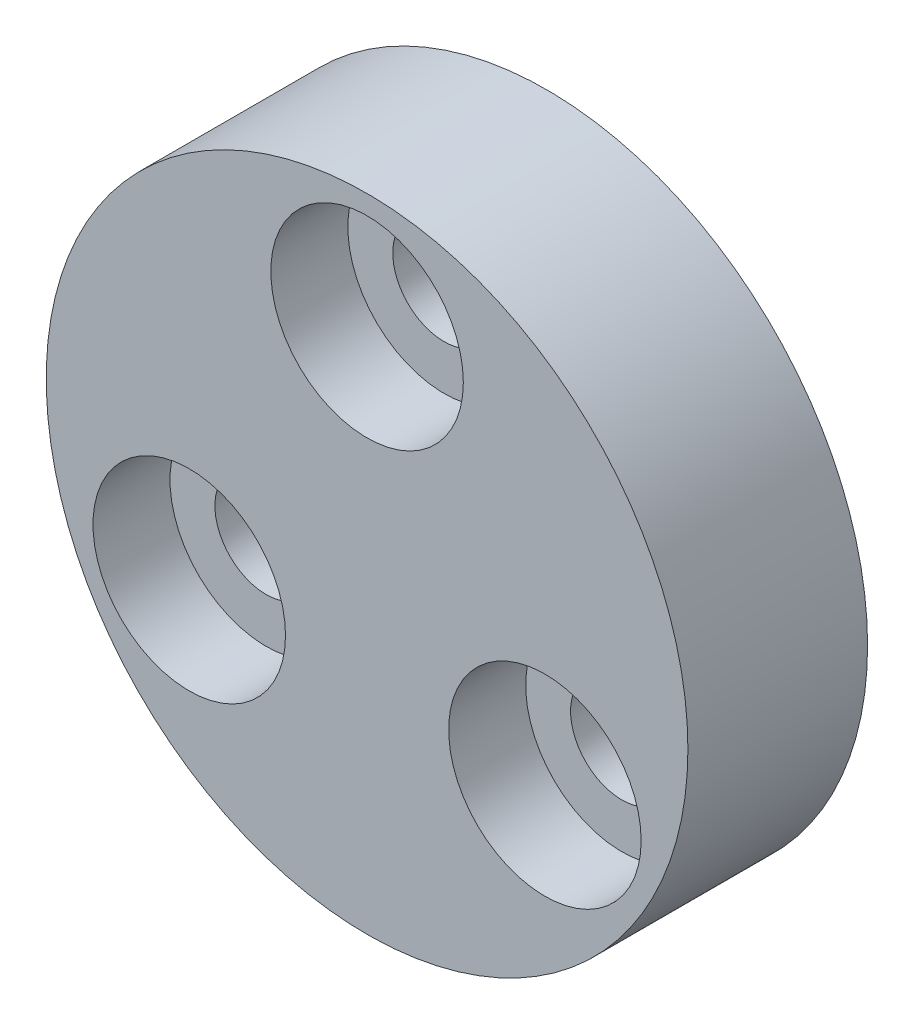
ISO-10303-21;
HEADER;
FILE_DESCRIPTION(('STEP AP214'),'2;1');
FILE_NAME('part.step','',(''),(''),'','','');
FILE_SCHEMA(('AUTOMOTIVE_DESIGN { 1 0 10303 214 1 1 1 1 }'));
ENDSEC;
DATA;
#1=APPLICATION_CONTEXT('core data for automotive mechanical design processes');
#2=APPLICATION_PROTOCOL_DEFINITION('international standard','automotive_design',2000,#1);
#3=PRODUCT_CONTEXT('',#1,'mechanical');
#4=PRODUCT('Part','Part','',(#3));
#5=PRODUCT_RELATED_PRODUCT_CATEGORY('part','',(#4));
#6=PRODUCT_DEFINITION_FORMATION('','',#4);
#7=PRODUCT_DEFINITION_CONTEXT('part definition',#1,'design');
#8=PRODUCT_DEFINITION('design','',#6,#7);
#9=PRODUCT_DEFINITION_SHAPE('','',#8);
#10=(LENGTH_UNIT() NAMED_UNIT(*) SI_UNIT(.MILLI.,.METRE.));
#11=(NAMED_UNIT(*) PLANE_ANGLE_UNIT() SI_UNIT($,.RADIAN.));
#12=(NAMED_UNIT(*) SI_UNIT($,.STERADIAN.) SOLID_ANGLE_UNIT());
#13=UNCERTAINTY_MEASURE_WITH_UNIT(LENGTH_MEASURE(1.E-05),#10,'distance_accuracy_value','');
#14=(GEOMETRIC_REPRESENTATION_CONTEXT(3) GLOBAL_UNCERTAINTY_ASSIGNED_CONTEXT((#13)) GLOBAL_UNIT_ASSIGNED_CONTEXT((#10,
#11,#12)) REPRESENTATION_CONTEXT('',''));
#15=CARTESIAN_POINT('',(0.,0.,0.));
#16=DIRECTION('',(0.,0.,1.));
#17=DIRECTION('',(1.,0.,0.));
#18=AXIS2_PLACEMENT_3D('',#15,#16,#17);
#19=CARTESIAN_POINT('',(0.,0.,4.));
#20=DIRECTION('',(0.,0.,1.));
#21=DIRECTION('',(1.,0.,0.));
#22=AXIS2_PLACEMENT_3D('',#19,#20,#21);
#23=PLANE('',#22);
#24=CARTESIAN_POINT('',(0.,8.,4.));
#25=DIRECTION('',(0.,0.,1.));
#26=DIRECTION('',(1.,0.,0.));
#27=AXIS2_PLACEMENT_3D('',#24,#25,#26);
#28=CIRCLE('',#27,2.);
#29=CARTESIAN_POINT('',(2.,8.,4.));
#30=VERTEX_POINT('',#29);
#31=EDGE_CURVE('E45',#30,#30,#28,.T.);
#32=ORIENTED_EDGE('',*,*,#31,.F.);
#33=EDGE_LOOP('',(#32));
#34=FACE_BOUND('',#33,.T.);
#35=CARTESIAN_POINT('',(0.,8.,4.));
#36=DIRECTION('',(0.,0.,1.));
#37=DIRECTION('',(1.,0.,0.));
#38=AXIS2_PLACEMENT_3D('',#35,#36,#37);
#39=CIRCLE('',#38,3.75);
#40=CARTESIAN_POINT('',(3.75,8.,4.));
#41=VERTEX_POINT('',#40);
#42=EDGE_CURVE('E78',#41,#41,#39,.T.);
#43=ORIENTED_EDGE('',*,*,#42,.T.);
#44=EDGE_LOOP('',(#43));
#45=FACE_BOUND('',#44,.T.);
#46=ADVANCED_FACE('F37',(#34,#45),#23,.T.);
#47=CARTESIAN_POINT('',(6.92820323027585,-3.9999999999998,4.));
#48=DIRECTION('',(0.,0.,1.));
#49=DIRECTION('',(1.,0.,0.));
#50=AXIS2_PLACEMENT_3D('',#47,#48,#49);
#51=CIRCLE('',#50,2.0000000000003);
#52=CARTESIAN_POINT('',(8.92820323027615,-3.9999999999998,4.));
#53=VERTEX_POINT('',#52);
#54=EDGE_CURVE('E56',#53,#53,#51,.T.);
#55=ORIENTED_EDGE('',*,*,#54,.F.);
#56=EDGE_LOOP('',(#55));
#57=FACE_BOUND('',#56,.T.);
#58=CARTESIAN_POINT('',(6.92820323027585,-3.9999999999998,4.));
#59=DIRECTION('',(0.,0.,1.));
#60=DIRECTION('',(1.,0.,0.));
#61=AXIS2_PLACEMENT_3D('',#58,#59,#60);
#62=CIRCLE('',#61,3.7500000000003);
#63=CARTESIAN_POINT('',(10.6782032302762,-3.9999999999998,4.));
#64=VERTEX_POINT('',#63);
#65=EDGE_CURVE('E86',#64,#64,#62,.T.);
#66=ORIENTED_EDGE('',*,*,#65,.T.);
#67=EDGE_LOOP('',(#66));
#68=FACE_BOUND('',#67,.T.);
#69=ADVANCED_FACE('F124',(#57,#68),#23,.T.);
#70=CARTESIAN_POINT('',(-6.92820323027517,-4.0000000000002,4.));
#71=DIRECTION('',(0.,0.,1.));
#72=DIRECTION('',(1.,0.,0.));
#73=AXIS2_PLACEMENT_3D('',#70,#71,#72);
#74=CIRCLE('',#73,2.00000000000045);
#75=CARTESIAN_POINT('',(-4.92820323027471,-4.0000000000002,4.));
#76=VERTEX_POINT('',#75);
#77=EDGE_CURVE('E62',#76,#76,#74,.T.);
#78=ORIENTED_EDGE('',*,*,#77,.F.);
#79=EDGE_LOOP('',(#78));
#80=FACE_BOUND('',#79,.T.);
#81=CARTESIAN_POINT('',(-6.92820323027517,-4.0000000000002,4.));
#82=DIRECTION('',(0.,0.,1.));
#83=DIRECTION('',(1.,0.,0.));
#84=AXIS2_PLACEMENT_3D('',#81,#82,#83);
#85=CIRCLE('',#84,3.75000000000046);
#86=CARTESIAN_POINT('',(-3.17820323027471,-4.0000000000002,4.));
#87=VERTEX_POINT('',#86);
#88=EDGE_CURVE('E94',#87,#87,#85,.T.);
#89=ORIENTED_EDGE('',*,*,#88,.T.);
#90=EDGE_LOOP('',(#89));
#91=FACE_BOUND('',#90,.T.);
#92=ADVANCED_FACE('F127',(#80,#91),#23,.T.);
#93=CARTESIAN_POINT('',(0.,0.,0.));
#94=DIRECTION('',(0.,0.,1.));
#95=DIRECTION('',(1.,0.,0.));
#96=AXIS2_PLACEMENT_3D('',#93,#94,#95);
#97=PLANE('',#96);
#98=CARTESIAN_POINT('',(0.,0.,0.));
#99=DIRECTION('',(0.,0.,1.));
#100=DIRECTION('',(1.,0.,0.));
#101=AXIS2_PLACEMENT_3D('',#98,#99,#100);
#102=CIRCLE('',#101,12.5);
#103=CARTESIAN_POINT('',(12.5,0.,0.));
#104=VERTEX_POINT('',#103);
#105=EDGE_CURVE('E10',#104,#104,#102,.T.);
#106=ORIENTED_EDGE('',*,*,#105,.F.);
#107=EDGE_LOOP('',(#106));
#108=FACE_BOUND('',#107,.T.);
#109=CARTESIAN_POINT('',(0.,8.,0.));
#110=DIRECTION('',(0.,0.,1.));
#111=DIRECTION('',(1.,0.,0.));
#112=AXIS2_PLACEMENT_3D('',#109,#110,#111);
#113=CIRCLE('',#112,2.);
#114=CARTESIAN_POINT('',(2.,8.,0.));
#115=VERTEX_POINT('',#114);
#116=EDGE_CURVE('E50',#115,#115,#113,.T.);
#117=ORIENTED_EDGE('',*,*,#116,.T.);
#118=EDGE_LOOP('',(#117));
#119=FACE_BOUND('',#118,.T.);
#120=CARTESIAN_POINT('',(6.92820323027585,-3.9999999999998,0.));
#121=DIRECTION('',(0.,0.,1.));
#122=DIRECTION('',(1.,0.,0.));
#123=AXIS2_PLACEMENT_3D('',#120,#121,#122);
#124=CIRCLE('',#123,2.0000000000003);
#125=CARTESIAN_POINT('',(8.92820323027615,-3.9999999999998,0.));
#126=VERTEX_POINT('',#125);
#127=EDGE_CURVE('E58',#126,#126,#124,.T.);
#128=ORIENTED_EDGE('',*,*,#127,.T.);
#129=EDGE_LOOP('',(#128));
#130=FACE_BOUND('',#129,.T.);
#131=CARTESIAN_POINT('',(-6.92820323027517,-4.0000000000002,0.));
#132=DIRECTION('',(0.,0.,1.));
#133=DIRECTION('',(1.,0.,0.));
#134=AXIS2_PLACEMENT_3D('',#131,#132,#133);
#135=CIRCLE('',#134,2.00000000000045);
#136=CARTESIAN_POINT('',(-4.92820323027471,-4.0000000000002,0.));
#137=VERTEX_POINT('',#136);
#138=EDGE_CURVE('E66',#137,#137,#135,.T.);
#139=ORIENTED_EDGE('',*,*,#138,.T.);
#140=EDGE_LOOP('',(#139));
#141=FACE_BOUND('',#140,.T.);
#142=ADVANCED_FACE('F135',(#108,#119,#130,#141),#97,.F.);
#143=CARTESIAN_POINT('',(0.,0.,4.));
#144=DIRECTION('',(0.,0.,-1.));
#145=DIRECTION('',(-1.,0.,0.));
#146=AXIS2_PLACEMENT_3D('',#143,#144,#145);
#147=CYLINDRICAL_SURFACE('',#146,12.5);
#148=ORIENTED_EDGE('',*,*,#105,.T.);
#149=EDGE_LOOP('',(#148));
#150=FACE_BOUND('',#149,.T.);
#151=CARTESIAN_POINT('',(0.,0.,7.));
#152=DIRECTION('',(0.,0.,1.));
#153=DIRECTION('',(1.,0.,0.));
#154=AXIS2_PLACEMENT_3D('',#151,#152,#153);
#155=CIRCLE('',#154,12.5);
#156=CARTESIAN_POINT('',(12.5,0.,7.));
#157=VERTEX_POINT('',#156);
#158=EDGE_CURVE('E70',#157,#157,#155,.T.);
#159=ORIENTED_EDGE('',*,*,#158,.F.);
#160=EDGE_LOOP('',(#159));
#161=FACE_BOUND('',#160,.T.);
#162=ADVANCED_FACE('F39',(#150,#161),#147,.T.);
#163=CARTESIAN_POINT('',(0.,8.,4.));
#164=DIRECTION('',(0.,0.,-1.));
#165=DIRECTION('',(-1.,0.,0.));
#166=AXIS2_PLACEMENT_3D('',#163,#164,#165);
#167=CYLINDRICAL_SURFACE('',#166,2.);
#168=ORIENTED_EDGE('',*,*,#31,.T.);
#169=EDGE_LOOP('',(#168));
#170=FACE_BOUND('',#169,.T.);
#171=ORIENTED_EDGE('',*,*,#116,.F.);
#172=EDGE_LOOP('',(#171));
#173=FACE_BOUND('',#172,.T.);
#174=ADVANCED_FACE('F172',(#170,#173),#167,.F.);
#175=CARTESIAN_POINT('',(6.92820323027585,-3.9999999999998,4.));
#176=DIRECTION('',(0.,0.,-1.));
#177=DIRECTION('',(-1.,0.,0.));
#178=AXIS2_PLACEMENT_3D('',#175,#176,#177);
#179=CYLINDRICAL_SURFACE('',#178,2.0000000000003);
#180=ORIENTED_EDGE('',*,*,#54,.T.);
#181=EDGE_LOOP('',(#180));
#182=FACE_BOUND('',#181,.T.);
#183=ORIENTED_EDGE('',*,*,#127,.F.);
#184=EDGE_LOOP('',(#183));
#185=FACE_BOUND('',#184,.T.);
#186=ADVANCED_FACE('F118',(#182,#185),#179,.F.);
#187=CARTESIAN_POINT('',(-6.92820323027517,-4.0000000000002,4.));
#188=DIRECTION('',(0.,0.,-1.));
#189=DIRECTION('',(-1.,0.,0.));
#190=AXIS2_PLACEMENT_3D('',#187,#188,#189);
#191=CYLINDRICAL_SURFACE('',#190,2.00000000000045);
#192=ORIENTED_EDGE('',*,*,#77,.T.);
#193=EDGE_LOOP('',(#192));
#194=FACE_BOUND('',#193,.T.);
#195=ORIENTED_EDGE('',*,*,#138,.F.);
#196=EDGE_LOOP('',(#195));
#197=FACE_BOUND('',#196,.T.);
#198=ADVANCED_FACE('F108',(#194,#197),#191,.F.);
#199=CARTESIAN_POINT('',(0.,0.,7.));
#200=DIRECTION('',(0.,0.,1.));
#201=DIRECTION('',(1.,0.,0.));
#202=AXIS2_PLACEMENT_3D('',#199,#200,#201);
#203=PLANE('',#202);
#204=CARTESIAN_POINT('',(6.92820323027585,-3.9999999999998,7.));
#205=DIRECTION('',(0.,0.,1.));
#206=DIRECTION('',(1.,0.,0.));
#207=AXIS2_PLACEMENT_3D('',#204,#205,#206);
#208=CIRCLE('',#207,3.7500000000003);
#209=CARTESIAN_POINT('',(10.6782032302762,-3.9999999999998,7.));
#210=VERTEX_POINT('',#209);
#211=EDGE_CURVE('E82',#210,#210,#208,.T.);
#212=ORIENTED_EDGE('',*,*,#211,.F.);
#213=EDGE_LOOP('',(#212));
#214=FACE_BOUND('',#213,.T.);
#215=ORIENTED_EDGE('',*,*,#158,.T.);
#216=EDGE_LOOP('',(#215));
#217=FACE_BOUND('',#216,.T.);
#218=CARTESIAN_POINT('',(0.,8.,7.));
#219=DIRECTION('',(0.,0.,1.));
#220=DIRECTION('',(1.,0.,0.));
#221=AXIS2_PLACEMENT_3D('',#218,#219,#220);
#222=CIRCLE('',#221,3.75);
#223=CARTESIAN_POINT('',(3.75,8.,7.));
#224=VERTEX_POINT('',#223);
#225=EDGE_CURVE('E77',#224,#224,#222,.T.);
#226=ORIENTED_EDGE('',*,*,#225,.F.);
#227=EDGE_LOOP('',(#226));
#228=FACE_BOUND('',#227,.T.);
#229=CARTESIAN_POINT('',(-6.92820323027517,-4.0000000000002,7.));
#230=DIRECTION('',(0.,0.,1.));
#231=DIRECTION('',(1.,0.,0.));
#232=AXIS2_PLACEMENT_3D('',#229,#230,#231);
#233=CIRCLE('',#232,3.75000000000046);
#234=CARTESIAN_POINT('',(-3.17820323027471,-4.0000000000002,7.));
#235=VERTEX_POINT('',#234);
#236=EDGE_CURVE('E90',#235,#235,#233,.T.);
#237=ORIENTED_EDGE('',*,*,#236,.F.);
#238=EDGE_LOOP('',(#237));
#239=FACE_BOUND('',#238,.T.);
#240=ADVANCED_FACE('F105',(#214,#217,#228,#239),#203,.T.);
#241=CARTESIAN_POINT('',(0.,8.,7.));
#242=DIRECTION('',(0.,0.,-1.));
#243=DIRECTION('',(-1.,0.,0.));
#244=AXIS2_PLACEMENT_3D('',#241,#242,#243);
#245=CYLINDRICAL_SURFACE('',#244,3.75);
#246=ORIENTED_EDGE('',*,*,#225,.T.);
#247=EDGE_LOOP('',(#246));
#248=FACE_BOUND('',#247,.T.);
#249=ORIENTED_EDGE('',*,*,#42,.F.);
#250=EDGE_LOOP('',(#249));
#251=FACE_BOUND('',#250,.T.);
#252=ADVANCED_FACE('F107',(#248,#251),#245,.F.);
#253=CARTESIAN_POINT('',(6.92820323027585,-3.9999999999998,7.));
#254=DIRECTION('',(0.,0.,-1.));
#255=DIRECTION('',(-1.,0.,0.));
#256=AXIS2_PLACEMENT_3D('',#253,#254,#255);
#257=CYLINDRICAL_SURFACE('',#256,3.7500000000003);
#258=ORIENTED_EDGE('',*,*,#211,.T.);
#259=EDGE_LOOP('',(#258));
#260=FACE_BOUND('',#259,.T.);
#261=ORIENTED_EDGE('',*,*,#65,.F.);
#262=EDGE_LOOP('',(#261));
#263=FACE_BOUND('',#262,.T.);
#264=ADVANCED_FACE('F115',(#260,#263),#257,.F.);
#265=CARTESIAN_POINT('',(-6.92820323027517,-4.0000000000002,7.));
#266=DIRECTION('',(0.,0.,-1.));
#267=DIRECTION('',(-1.,0.,0.));
#268=AXIS2_PLACEMENT_3D('',#265,#266,#267);
#269=CYLINDRICAL_SURFACE('',#268,3.75000000000046);
#270=ORIENTED_EDGE('',*,*,#236,.T.);
#271=EDGE_LOOP('',(#270));
#272=FACE_BOUND('',#271,.T.);
#273=ORIENTED_EDGE('',*,*,#88,.F.);
#274=EDGE_LOOP('',(#273));
#275=FACE_BOUND('',#274,.T.);
#276=ADVANCED_FACE('F102',(#272,#275),#269,.F.);
#277=CLOSED_SHELL('',(#46,#69,#92,#142,#162,#174,#186,#198,#240,#252,#264,#276));
#278=MANIFOLD_SOLID_BREP('B2',#277);
#279=ADVANCED_BREP_SHAPE_REPRESENTATION('',(#18,#278),#14);
#280=SHAPE_DEFINITION_REPRESENTATION(#9,#279);
ENDSEC;
END-ISO-10303-21;
